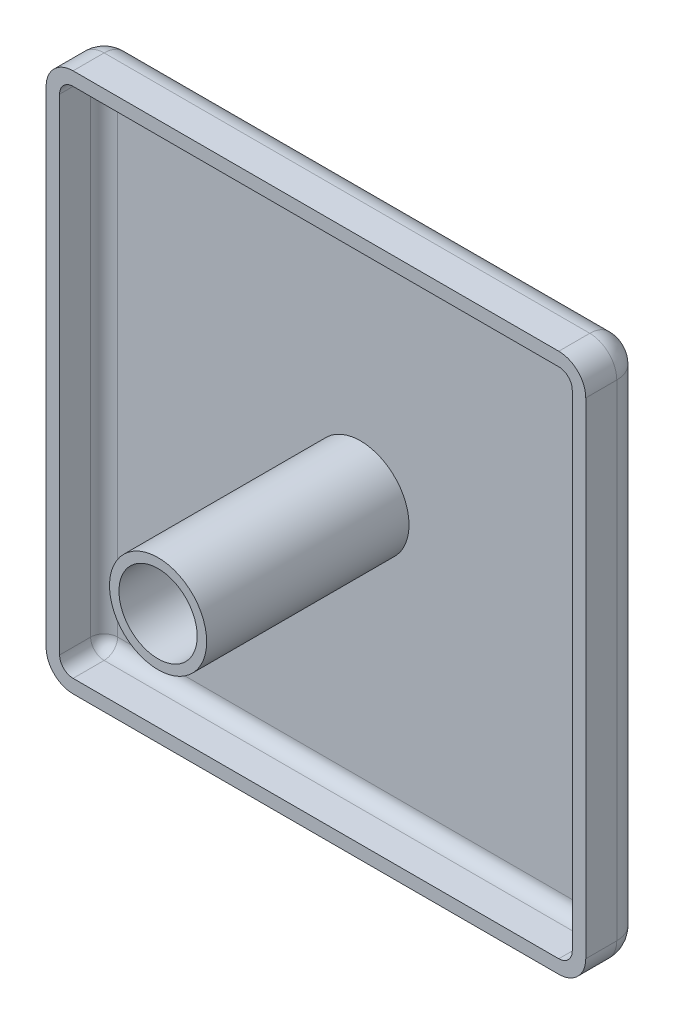
ISO-10303-21;
HEADER;
FILE_DESCRIPTION(('STEP AP214'),'2;1');
FILE_NAME('part.step','',(''),(''),'','','');
FILE_SCHEMA(('AUTOMOTIVE_DESIGN { 1 0 10303 214 1 1 1 1 }'));
ENDSEC;
DATA;
#1=APPLICATION_CONTEXT('core data for automotive mechanical design processes');
#2=APPLICATION_PROTOCOL_DEFINITION('international standard','automotive_design',2000,#1);
#3=PRODUCT_CONTEXT('',#1,'mechanical');
#4=PRODUCT('Part','Part','',(#3));
#5=PRODUCT_RELATED_PRODUCT_CATEGORY('part','',(#4));
#6=PRODUCT_DEFINITION_FORMATION('','',#4);
#7=PRODUCT_DEFINITION_CONTEXT('part definition',#1,'design');
#8=PRODUCT_DEFINITION('design','',#6,#7);
#9=PRODUCT_DEFINITION_SHAPE('','',#8);
#10=(LENGTH_UNIT() NAMED_UNIT(*) SI_UNIT(.MILLI.,.METRE.));
#11=(NAMED_UNIT(*) PLANE_ANGLE_UNIT() SI_UNIT($,.RADIAN.));
#12=(NAMED_UNIT(*) SI_UNIT($,.STERADIAN.) SOLID_ANGLE_UNIT());
#13=UNCERTAINTY_MEASURE_WITH_UNIT(LENGTH_MEASURE(1.E-05),#10,'distance_accuracy_value','');
#14=(GEOMETRIC_REPRESENTATION_CONTEXT(3) GLOBAL_UNCERTAINTY_ASSIGNED_CONTEXT((#13)) GLOBAL_UNIT_ASSIGNED_CONTEXT((#10,
#11,#12)) REPRESENTATION_CONTEXT('',''));
#15=CARTESIAN_POINT('',(0.,0.,0.));
#16=DIRECTION('',(0.,0.,1.));
#17=DIRECTION('',(1.,0.,0.));
#18=AXIS2_PLACEMENT_3D('',#15,#16,#17);
#19=CARTESIAN_POINT('',(20.,-20.,1.));
#20=DIRECTION('',(0.,0.,1.));
#21=DIRECTION('',(1.,0.,0.));
#22=AXIS2_PLACEMENT_3D('',#19,#20,#21);
#23=PLANE('',#22);
#24=DIRECTION('',(0.,1.,0.));
#25=VECTOR('',#24,1.);
#26=CARTESIAN_POINT('',(-18.,-20.,1.));
#27=LINE('',#26,#25);
#28=CARTESIAN_POINT('',(-18.,-18.,1.));
#29=VERTEX_POINT('',#28);
#30=CARTESIAN_POINT('',(-18.,18.,1.));
#31=VERTEX_POINT('',#30);
#32=EDGE_CURVE('E238',#29,#31,#27,.T.);
#33=ORIENTED_EDGE('',*,*,#32,.F.);
#34=DIRECTION('',(1.,0.,0.));
#35=VECTOR('',#34,1.);
#36=CARTESIAN_POINT('',(20.,-18.,1.));
#37=LINE('',#36,#35);
#38=CARTESIAN_POINT('',(18.,-18.,1.));
#39=VERTEX_POINT('',#38);
#40=EDGE_CURVE('E240',#39,#29,#37,.F.);
#41=ORIENTED_EDGE('',*,*,#40,.F.);
#42=DIRECTION('',(0.,1.,0.));
#43=VECTOR('',#42,1.);
#44=CARTESIAN_POINT('',(18.,-20.,1.));
#45=LINE('',#44,#43);
#46=CARTESIAN_POINT('',(18.,18.,1.));
#47=VERTEX_POINT('',#46);
#48=EDGE_CURVE('E206',#47,#39,#45,.F.);
#49=ORIENTED_EDGE('',*,*,#48,.F.);
#50=DIRECTION('',(1.,0.,0.));
#51=VECTOR('',#50,1.);
#52=CARTESIAN_POINT('',(20.,18.,1.));
#53=LINE('',#52,#51);
#54=EDGE_CURVE('E232',#31,#47,#53,.T.);
#55=ORIENTED_EDGE('',*,*,#54,.F.);
#56=EDGE_LOOP('',(#33,#41,#49,#55));
#57=FACE_BOUND('',#56,.T.);
#58=CARTESIAN_POINT('',(0.,0.,1.));
#59=DIRECTION('',(0.,0.,1.));
#60=DIRECTION('',(1.,0.,0.));
#61=AXIS2_PLACEMENT_3D('',#58,#59,#60);
#62=CIRCLE('',#61,3.6);
#63=CARTESIAN_POINT('',(3.6,0.,1.));
#64=VERTEX_POINT('',#63);
#65=EDGE_CURVE('E790',#64,#64,#62,.T.);
#66=ORIENTED_EDGE('',*,*,#65,.F.);
#67=EDGE_LOOP('',(#66));
#68=FACE_BOUND('',#67,.T.);
#69=ADVANCED_FACE('F37',(#57,#68),#23,.T.);
#70=CARTESIAN_POINT('',(20.,20.,4.3));
#71=DIRECTION('',(-1.,0.,0.));
#72=DIRECTION('',(0.,-1.,0.));
#73=AXIS2_PLACEMENT_3D('',#70,#71,#72);
#74=PLANE('',#73);
#75=DIRECTION('',(0.,1.,0.));
#76=VECTOR('',#75,1.);
#77=CARTESIAN_POINT('',(20.,20.,4.3));
#78=LINE('',#77,#76);
#79=CARTESIAN_POINT('',(20.,-18.,4.3));
#80=VERTEX_POINT('',#79);
#81=CARTESIAN_POINT('',(20.,18.,4.3));
#82=VERTEX_POINT('',#81);
#83=EDGE_CURVE('E284',#80,#82,#78,.T.);
#84=ORIENTED_EDGE('',*,*,#83,.F.);
#85=DIRECTION('',(0.,0.,-1.));
#86=VECTOR('',#85,1.);
#87=CARTESIAN_POINT('',(20.,-18.,4.3));
#88=LINE('',#87,#86);
#89=CARTESIAN_POINT('',(20.,-18.,2.));
#90=VERTEX_POINT('',#89);
#91=EDGE_CURVE('E62',#80,#90,#88,.T.);
#92=ORIENTED_EDGE('',*,*,#91,.T.);
#93=DIRECTION('',(0.,1.,0.));
#94=VECTOR('',#93,1.);
#95=CARTESIAN_POINT('',(20.,20.,2.));
#96=LINE('',#95,#94);
#97=CARTESIAN_POINT('',(20.,18.,2.));
#98=VERTEX_POINT('',#97);
#99=EDGE_CURVE('E326',#90,#98,#96,.T.);
#100=ORIENTED_EDGE('',*,*,#99,.T.);
#101=DIRECTION('',(0.,0.,-1.));
#102=VECTOR('',#101,1.);
#103=CARTESIAN_POINT('',(20.,18.,4.3));
#104=LINE('',#103,#102);
#105=EDGE_CURVE('E324',#98,#82,#104,.F.);
#106=ORIENTED_EDGE('',*,*,#105,.T.);
#107=EDGE_LOOP('',(#84,#92,#100,#106));
#108=FACE_BOUND('',#107,.T.);
#109=ADVANCED_FACE('F376',(#108),#74,.F.);
#110=CARTESIAN_POINT('',(-20.,20.,4.3));
#111=DIRECTION('',(0.,-1.,0.));
#112=DIRECTION('',(0.,0.,-1.));
#113=AXIS2_PLACEMENT_3D('',#110,#111,#112);
#114=PLANE('',#113);
#115=DIRECTION('',(-1.,0.,0.));
#116=VECTOR('',#115,1.);
#117=CARTESIAN_POINT('',(-20.,20.,4.3));
#118=LINE('',#117,#116);
#119=CARTESIAN_POINT('',(18.,20.,4.3));
#120=VERTEX_POINT('',#119);
#121=CARTESIAN_POINT('',(-18.,20.,4.3));
#122=VERTEX_POINT('',#121);
#123=EDGE_CURVE('E287',#120,#122,#118,.T.);
#124=ORIENTED_EDGE('',*,*,#123,.F.);
#125=DIRECTION('',(0.,0.,-1.));
#126=VECTOR('',#125,1.);
#127=CARTESIAN_POINT('',(18.,20.,4.3));
#128=LINE('',#127,#126);
#129=CARTESIAN_POINT('',(18.,20.,2.));
#130=VERTEX_POINT('',#129);
#131=EDGE_CURVE('E301',#120,#130,#128,.T.);
#132=ORIENTED_EDGE('',*,*,#131,.T.);
#133=DIRECTION('',(-1.,0.,0.));
#134=VECTOR('',#133,1.);
#135=CARTESIAN_POINT('',(-20.,20.,2.));
#136=LINE('',#135,#134);
#137=CARTESIAN_POINT('',(-18.,20.,2.));
#138=VERTEX_POINT('',#137);
#139=EDGE_CURVE('E298',#130,#138,#136,.T.);
#140=ORIENTED_EDGE('',*,*,#139,.T.);
#141=DIRECTION('',(0.,0.,-1.));
#142=VECTOR('',#141,1.);
#143=CARTESIAN_POINT('',(-18.,20.,4.3));
#144=LINE('',#143,#142);
#145=EDGE_CURVE('E296',#138,#122,#144,.F.);
#146=ORIENTED_EDGE('',*,*,#145,.T.);
#147=EDGE_LOOP('',(#124,#132,#140,#146));
#148=FACE_BOUND('',#147,.T.);
#149=ADVANCED_FACE('F388',(#148),#114,.F.);
#150=CARTESIAN_POINT('',(-20.,20.,4.3));
#151=DIRECTION('',(1.,0.,0.));
#152=DIRECTION('',(0.,1.,0.));
#153=AXIS2_PLACEMENT_3D('',#150,#151,#152);
#154=PLANE('',#153);
#155=DIRECTION('',(0.,-1.,0.));
#156=VECTOR('',#155,1.);
#157=CARTESIAN_POINT('',(-20.,20.,2.));
#158=LINE('',#157,#156);
#159=CARTESIAN_POINT('',(-20.,18.,2.));
#160=VERTEX_POINT('',#159);
#161=CARTESIAN_POINT('',(-20.,-18.,2.));
#162=VERTEX_POINT('',#161);
#163=EDGE_CURVE('E314',#160,#162,#158,.T.);
#164=ORIENTED_EDGE('',*,*,#163,.T.);
#165=DIRECTION('',(0.,0.,-1.));
#166=VECTOR('',#165,1.);
#167=CARTESIAN_POINT('',(-20.,-18.,4.3));
#168=LINE('',#167,#166);
#169=CARTESIAN_POINT('',(-20.,-18.,4.3));
#170=VERTEX_POINT('',#169);
#171=EDGE_CURVE('E316',#162,#170,#168,.F.);
#172=ORIENTED_EDGE('',*,*,#171,.T.);
#173=DIRECTION('',(0.,-1.,0.));
#174=VECTOR('',#173,1.);
#175=CARTESIAN_POINT('',(-20.,20.,4.3));
#176=LINE('',#175,#174);
#177=CARTESIAN_POINT('',(-20.,18.,4.3));
#178=VERTEX_POINT('',#177);
#179=EDGE_CURVE('E290',#178,#170,#176,.T.);
#180=ORIENTED_EDGE('',*,*,#179,.F.);
#181=DIRECTION('',(0.,0.,-1.));
#182=VECTOR('',#181,1.);
#183=CARTESIAN_POINT('',(-20.,18.,4.3));
#184=LINE('',#183,#182);
#185=EDGE_CURVE('E312',#178,#160,#184,.T.);
#186=ORIENTED_EDGE('',*,*,#185,.T.);
#187=EDGE_LOOP('',(#164,#172,#180,#186));
#188=FACE_BOUND('',#187,.T.);
#189=ADVANCED_FACE('F398',(#188),#154,.F.);
#190=CARTESIAN_POINT('',(-20.,-20.,4.3));
#191=DIRECTION('',(0.,1.,0.));
#192=DIRECTION('',(0.,0.,1.));
#193=AXIS2_PLACEMENT_3D('',#190,#191,#192);
#194=PLANE('',#193);
#195=DIRECTION('',(1.,0.,0.));
#196=VECTOR('',#195,1.);
#197=CARTESIAN_POINT('',(-20.,-20.,4.3));
#198=LINE('',#197,#196);
#199=CARTESIAN_POINT('',(-18.,-20.,4.3));
#200=VERTEX_POINT('',#199);
#201=CARTESIAN_POINT('',(18.,-20.,4.3));
#202=VERTEX_POINT('',#201);
#203=EDGE_CURVE('E293',#200,#202,#198,.T.);
#204=ORIENTED_EDGE('',*,*,#203,.F.);
#205=DIRECTION('',(0.,0.,-1.));
#206=VECTOR('',#205,1.);
#207=CARTESIAN_POINT('',(-18.,-20.,4.3));
#208=LINE('',#207,#206);
#209=CARTESIAN_POINT('',(-18.,-20.,2.));
#210=VERTEX_POINT('',#209);
#211=EDGE_CURVE('E322',#200,#210,#208,.T.);
#212=ORIENTED_EDGE('',*,*,#211,.T.);
#213=DIRECTION('',(1.,0.,0.));
#214=VECTOR('',#213,1.);
#215=CARTESIAN_POINT('',(-20.,-20.,2.));
#216=LINE('',#215,#214);
#217=CARTESIAN_POINT('',(18.,-20.,2.));
#218=VERTEX_POINT('',#217);
#219=EDGE_CURVE('E320',#210,#218,#216,.T.);
#220=ORIENTED_EDGE('',*,*,#219,.T.);
#221=DIRECTION('',(0.,0.,-1.));
#222=VECTOR('',#221,1.);
#223=CARTESIAN_POINT('',(18.,-20.,4.3));
#224=LINE('',#223,#222);
#225=EDGE_CURVE('E318',#218,#202,#224,.F.);
#226=ORIENTED_EDGE('',*,*,#225,.T.);
#227=EDGE_LOOP('',(#204,#212,#220,#226));
#228=FACE_BOUND('',#227,.T.);
#229=ADVANCED_FACE('F420',(#228),#194,.F.);
#230=CARTESIAN_POINT('',(20.,-20.,4.3));
#231=DIRECTION('',(0.,0.,1.));
#232=DIRECTION('',(1.,0.,0.));
#233=AXIS2_PLACEMENT_3D('',#230,#231,#232);
#234=PLANE('',#233);
#235=DIRECTION('',(0.,-1.,0.));
#236=VECTOR('',#235,1.);
#237=CARTESIAN_POINT('',(-19.,20.,4.3));
#238=LINE('',#237,#236);
#239=CARTESIAN_POINT('',(-19.,18.,4.3));
#240=VERTEX_POINT('',#239);
#241=CARTESIAN_POINT('',(-19.,-18.,4.3));
#242=VERTEX_POINT('',#241);
#243=EDGE_CURVE('E274',#240,#242,#238,.T.);
#244=ORIENTED_EDGE('',*,*,#243,.F.);
#245=CARTESIAN_POINT('',(-18.,18.,4.3));
#246=DIRECTION('',(0.,0.,1.));
#247=DIRECTION('',(1.,0.,0.));
#248=AXIS2_PLACEMENT_3D('',#245,#246,#247);
#249=CIRCLE('',#248,1.);
#250=CARTESIAN_POINT('',(-18.,19.,4.3));
#251=VERTEX_POINT('',#250);
#252=EDGE_CURVE('E188',#251,#240,#249,.T.);
#253=ORIENTED_EDGE('',*,*,#252,.F.);
#254=DIRECTION('',(-1.,0.,0.));
#255=VECTOR('',#254,1.);
#256=CARTESIAN_POINT('',(-20.,19.,4.3));
#257=LINE('',#256,#255);
#258=CARTESIAN_POINT('',(18.,19.,4.3));
#259=VERTEX_POINT('',#258);
#260=EDGE_CURVE('E54',#259,#251,#257,.T.);
#261=ORIENTED_EDGE('',*,*,#260,.F.);
#262=CARTESIAN_POINT('',(18.,18.,4.3));
#263=DIRECTION('',(0.,0.,1.));
#264=DIRECTION('',(1.,0.,0.));
#265=AXIS2_PLACEMENT_3D('',#262,#263,#264);
#266=CIRCLE('',#265,1.);
#267=CARTESIAN_POINT('',(19.,18.,4.3));
#268=VERTEX_POINT('',#267);
#269=EDGE_CURVE('E271',#268,#259,#266,.T.);
#270=ORIENTED_EDGE('',*,*,#269,.F.);
#271=DIRECTION('',(0.,1.,0.));
#272=VECTOR('',#271,1.);
#273=CARTESIAN_POINT('',(19.,20.,4.3));
#274=LINE('',#273,#272);
#275=CARTESIAN_POINT('',(19.,-18.,4.3));
#276=VERTEX_POINT('',#275);
#277=EDGE_CURVE('E246',#276,#268,#274,.T.);
#278=ORIENTED_EDGE('',*,*,#277,.F.);
#279=CARTESIAN_POINT('',(18.,-18.,4.3));
#280=DIRECTION('',(0.,0.,1.));
#281=DIRECTION('',(1.,0.,0.));
#282=AXIS2_PLACEMENT_3D('',#279,#280,#281);
#283=CIRCLE('',#282,1.);
#284=CARTESIAN_POINT('',(18.,-19.,4.3));
#285=VERTEX_POINT('',#284);
#286=EDGE_CURVE('E183',#285,#276,#283,.T.);
#287=ORIENTED_EDGE('',*,*,#286,.F.);
#288=DIRECTION('',(1.,0.,0.));
#289=VECTOR('',#288,1.);
#290=CARTESIAN_POINT('',(-20.,-19.,4.3));
#291=LINE('',#290,#289);
#292=CARTESIAN_POINT('',(-18.,-19.,4.3));
#293=VERTEX_POINT('',#292);
#294=EDGE_CURVE('E259',#293,#285,#291,.T.);
#295=ORIENTED_EDGE('',*,*,#294,.F.);
#296=CARTESIAN_POINT('',(-18.,-18.,4.3));
#297=DIRECTION('',(0.,0.,1.));
#298=DIRECTION('',(1.,0.,0.));
#299=AXIS2_PLACEMENT_3D('',#296,#297,#298);
#300=CIRCLE('',#299,1.);
#301=EDGE_CURVE('E278',#242,#293,#300,.T.);
#302=ORIENTED_EDGE('',*,*,#301,.F.);
#303=EDGE_LOOP('',(#244,#253,#261,#270,#278,#287,#295,#302));
#304=FACE_BOUND('',#303,.T.);
#305=ORIENTED_EDGE('',*,*,#179,.T.);
#306=CARTESIAN_POINT('',(-18.,-18.,4.3));
#307=DIRECTION('',(0.,0.,1.));
#308=DIRECTION('',(1.,0.,0.));
#309=AXIS2_PLACEMENT_3D('',#306,#307,#308);
#310=CIRCLE('',#309,2.);
#311=EDGE_CURVE('E11',#170,#200,#310,.T.);
#312=ORIENTED_EDGE('',*,*,#311,.T.);
#313=ORIENTED_EDGE('',*,*,#203,.T.);
#314=CARTESIAN_POINT('',(18.,-18.,4.3));
#315=DIRECTION('',(0.,0.,1.));
#316=DIRECTION('',(1.,0.,0.));
#317=AXIS2_PLACEMENT_3D('',#314,#315,#316);
#318=CIRCLE('',#317,2.);
#319=EDGE_CURVE('E46',#202,#80,#318,.T.);
#320=ORIENTED_EDGE('',*,*,#319,.T.);
#321=ORIENTED_EDGE('',*,*,#83,.T.);
#322=CARTESIAN_POINT('',(18.,18.,4.3));
#323=DIRECTION('',(0.,0.,1.));
#324=DIRECTION('',(1.,0.,0.));
#325=AXIS2_PLACEMENT_3D('',#322,#323,#324);
#326=CIRCLE('',#325,2.);
#327=EDGE_CURVE('E331',#82,#120,#326,.T.);
#328=ORIENTED_EDGE('',*,*,#327,.T.);
#329=ORIENTED_EDGE('',*,*,#123,.T.);
#330=CARTESIAN_POINT('',(-18.,18.,4.3));
#331=DIRECTION('',(0.,0.,1.));
#332=DIRECTION('',(1.,0.,0.));
#333=AXIS2_PLACEMENT_3D('',#330,#331,#332);
#334=CIRCLE('',#333,2.);
#335=EDGE_CURVE('E329',#122,#178,#334,.T.);
#336=ORIENTED_EDGE('',*,*,#335,.T.);
#337=EDGE_LOOP('',(#305,#312,#313,#320,#321,#328,#329,#336));
#338=FACE_BOUND('',#337,.T.);
#339=ADVANCED_FACE('F385',(#304,#338),#234,.T.);
#340=CARTESIAN_POINT('',(20.,-20.,0.));
#341=DIRECTION('',(0.,0.,1.));
#342=DIRECTION('',(1.,0.,0.));
#343=AXIS2_PLACEMENT_3D('',#340,#341,#342);
#344=PLANE('',#343);
#345=DIRECTION('',(0.,-1.,0.));
#346=VECTOR('',#345,1.);
#347=CARTESIAN_POINT('',(-18.,-20.,0.));
#348=LINE('',#347,#346);
#349=CARTESIAN_POINT('',(-18.,-18.,0.));
#350=VERTEX_POINT('',#349);
#351=CARTESIAN_POINT('',(-18.,18.,0.));
#352=VERTEX_POINT('',#351);
#353=EDGE_CURVE('E307',#350,#352,#348,.F.);
#354=ORIENTED_EDGE('',*,*,#353,.T.);
#355=DIRECTION('',(-1.,0.,0.));
#356=VECTOR('',#355,1.);
#357=CARTESIAN_POINT('',(20.,18.,0.));
#358=LINE('',#357,#356);
#359=CARTESIAN_POINT('',(18.,18.,0.));
#360=VERTEX_POINT('',#359);
#361=EDGE_CURVE('E309',#352,#360,#358,.F.);
#362=ORIENTED_EDGE('',*,*,#361,.T.);
#363=DIRECTION('',(0.,1.,0.));
#364=VECTOR('',#363,1.);
#365=CARTESIAN_POINT('',(18.,-20.,0.));
#366=LINE('',#365,#364);
#367=CARTESIAN_POINT('',(18.,-18.,0.));
#368=VERTEX_POINT('',#367);
#369=EDGE_CURVE('E303',#360,#368,#366,.F.);
#370=ORIENTED_EDGE('',*,*,#369,.T.);
#371=DIRECTION('',(1.,0.,0.));
#372=VECTOR('',#371,1.);
#373=CARTESIAN_POINT('',(20.,-18.,0.));
#374=LINE('',#373,#372);
#375=EDGE_CURVE('E305',#368,#350,#374,.F.);
#376=ORIENTED_EDGE('',*,*,#375,.T.);
#377=EDGE_LOOP('',(#354,#362,#370,#376));
#378=FACE_BOUND('',#377,.T.);
#379=ADVANCED_FACE('F415',(#378),#344,.F.);
#380=CARTESIAN_POINT('',(18.,-18.,4.3));
#381=DIRECTION('',(0.,0.,-1.));
#382=DIRECTION('',(-1.,0.,0.));
#383=AXIS2_PLACEMENT_3D('',#380,#381,#382);
#384=CYLINDRICAL_SURFACE('',#383,2.);
#385=ORIENTED_EDGE('',*,*,#319,.F.);
#386=ORIENTED_EDGE('',*,*,#225,.F.);
#387=CARTESIAN_POINT('',(18.,-18.,2.));
#388=DIRECTION('',(0.,0.,-1.));
#389=DIRECTION('',(-1.,0.,0.));
#390=AXIS2_PLACEMENT_3D('',#387,#388,#389);
#391=CIRCLE('',#390,2.);
#392=EDGE_CURVE('E360',#90,#218,#391,.T.);
#393=ORIENTED_EDGE('',*,*,#392,.F.);
#394=ORIENTED_EDGE('',*,*,#91,.F.);
#395=EDGE_LOOP('',(#385,#386,#393,#394));
#396=FACE_BOUND('',#395,.T.);
#397=ADVANCED_FACE('F39',(#396),#384,.T.);
#398=CARTESIAN_POINT('',(-18.,-18.,4.3));
#399=DIRECTION('',(0.,0.,-1.));
#400=DIRECTION('',(-1.,0.,0.));
#401=AXIS2_PLACEMENT_3D('',#398,#399,#400);
#402=CYLINDRICAL_SURFACE('',#401,2.);
#403=ORIENTED_EDGE('',*,*,#311,.F.);
#404=ORIENTED_EDGE('',*,*,#171,.F.);
#405=CARTESIAN_POINT('',(-18.,-18.,2.));
#406=DIRECTION('',(0.,0.,-1.));
#407=DIRECTION('',(-1.,0.,0.));
#408=AXIS2_PLACEMENT_3D('',#405,#406,#407);
#409=CIRCLE('',#408,2.);
#410=EDGE_CURVE('E358',#210,#162,#409,.T.);
#411=ORIENTED_EDGE('',*,*,#410,.F.);
#412=ORIENTED_EDGE('',*,*,#211,.F.);
#413=EDGE_LOOP('',(#403,#404,#411,#412));
#414=FACE_BOUND('',#413,.T.);
#415=ADVANCED_FACE('F403',(#414),#402,.T.);
#416=CARTESIAN_POINT('',(-20.,-18.,2.));
#417=DIRECTION('',(1.,0.,0.));
#418=DIRECTION('',(0.,0.,-1.));
#419=AXIS2_PLACEMENT_3D('',#416,#417,#418);
#420=CYLINDRICAL_SURFACE('',#419,2.);
#421=CARTESIAN_POINT('',(18.,-18.,2.));
#422=DIRECTION('',(1.,0.,0.));
#423=DIRECTION('',(0.,0.,-1.));
#424=AXIS2_PLACEMENT_3D('',#421,#422,#423);
#425=CIRCLE('',#424,2.);
#426=EDGE_CURVE('E41',#218,#368,#425,.T.);
#427=ORIENTED_EDGE('',*,*,#426,.F.);
#428=ORIENTED_EDGE('',*,*,#219,.F.);
#429=CARTESIAN_POINT('',(-18.,-18.,2.));
#430=DIRECTION('',(-1.,0.,0.));
#431=DIRECTION('',(0.,0.,1.));
#432=AXIS2_PLACEMENT_3D('',#429,#430,#431);
#433=CIRCLE('',#432,2.);
#434=EDGE_CURVE('E355',#350,#210,#433,.T.);
#435=ORIENTED_EDGE('',*,*,#434,.F.);
#436=ORIENTED_EDGE('',*,*,#375,.F.);
#437=EDGE_LOOP('',(#427,#428,#435,#436));
#438=FACE_BOUND('',#437,.T.);
#439=ADVANCED_FACE('F416',(#438),#420,.T.);
#440=CARTESIAN_POINT('',(18.,-18.,2.));
#441=DIRECTION('',(0.,0.,1.));
#442=DIRECTION('',(1.,0.,0.));
#443=AXIS2_PLACEMENT_3D('',#440,#441,#442);
#444=SPHERICAL_SURFACE('',#443,2.);
#445=ORIENTED_EDGE('',*,*,#392,.T.);
#446=ORIENTED_EDGE('',*,*,#426,.T.);
#447=CARTESIAN_POINT('',(18.,-18.,2.));
#448=DIRECTION('',(0.,-1.,0.));
#449=DIRECTION('',(1.,0.,0.));
#450=AXIS2_PLACEMENT_3D('',#447,#448,#449);
#451=CIRCLE('',#450,2.);
#452=EDGE_CURVE('E352',#90,#368,#451,.F.);
#453=ORIENTED_EDGE('',*,*,#452,.F.);
#454=EDGE_LOOP('',(#445,#446,#453));
#455=FACE_BOUND('',#454,.T.);
#456=ADVANCED_FACE('F366',(#455),#444,.T.);
#457=CARTESIAN_POINT('',(-18.,-18.,2.));
#458=DIRECTION('',(0.,0.,1.));
#459=DIRECTION('',(1.,0.,0.));
#460=AXIS2_PLACEMENT_3D('',#457,#458,#459);
#461=SPHERICAL_SURFACE('',#460,2.);
#462=ORIENTED_EDGE('',*,*,#434,.T.);
#463=ORIENTED_EDGE('',*,*,#410,.T.);
#464=CARTESIAN_POINT('',(-18.,-18.,2.));
#465=DIRECTION('',(0.,-1.,0.));
#466=DIRECTION('',(0.,0.,-1.));
#467=AXIS2_PLACEMENT_3D('',#464,#465,#466);
#468=CIRCLE('',#467,2.);
#469=EDGE_CURVE('E349',#350,#162,#468,.F.);
#470=ORIENTED_EDGE('',*,*,#469,.F.);
#471=EDGE_LOOP('',(#462,#463,#470));
#472=FACE_BOUND('',#471,.T.);
#473=ADVANCED_FACE('F407',(#472),#461,.T.);
#474=CARTESIAN_POINT('',(18.,20.,2.));
#475=DIRECTION('',(0.,1.,0.));
#476=DIRECTION('',(-1.,0.,0.));
#477=AXIS2_PLACEMENT_3D('',#474,#475,#476);
#478=CYLINDRICAL_SURFACE('',#477,2.);
#479=ORIENTED_EDGE('',*,*,#452,.T.);
#480=ORIENTED_EDGE('',*,*,#369,.F.);
#481=CARTESIAN_POINT('',(18.,18.,2.));
#482=DIRECTION('',(0.,1.,0.));
#483=DIRECTION('',(0.,0.,1.));
#484=AXIS2_PLACEMENT_3D('',#481,#482,#483);
#485=CIRCLE('',#484,2.);
#486=EDGE_CURVE('E346',#98,#360,#485,.T.);
#487=ORIENTED_EDGE('',*,*,#486,.F.);
#488=ORIENTED_EDGE('',*,*,#99,.F.);
#489=EDGE_LOOP('',(#479,#480,#487,#488));
#490=FACE_BOUND('',#489,.T.);
#491=ADVANCED_FACE('F373',(#490),#478,.T.);
#492=CARTESIAN_POINT('',(18.,18.,4.3));
#493=DIRECTION('',(0.,0.,-1.));
#494=DIRECTION('',(-1.,0.,0.));
#495=AXIS2_PLACEMENT_3D('',#492,#493,#494);
#496=CYLINDRICAL_SURFACE('',#495,2.);
#497=ORIENTED_EDGE('',*,*,#327,.F.);
#498=ORIENTED_EDGE('',*,*,#105,.F.);
#499=CARTESIAN_POINT('',(18.,18.,2.));
#500=DIRECTION('',(0.,0.,-1.));
#501=DIRECTION('',(-1.,0.,0.));
#502=AXIS2_PLACEMENT_3D('',#499,#500,#501);
#503=CIRCLE('',#502,2.);
#504=EDGE_CURVE('E343',#130,#98,#503,.T.);
#505=ORIENTED_EDGE('',*,*,#504,.F.);
#506=ORIENTED_EDGE('',*,*,#131,.F.);
#507=EDGE_LOOP('',(#497,#498,#505,#506));
#508=FACE_BOUND('',#507,.T.);
#509=ADVANCED_FACE('F380',(#508),#496,.T.);
#510=CARTESIAN_POINT('',(-18.,18.,4.3));
#511=DIRECTION('',(0.,0.,-1.));
#512=DIRECTION('',(-1.,0.,0.));
#513=AXIS2_PLACEMENT_3D('',#510,#511,#512);
#514=CYLINDRICAL_SURFACE('',#513,2.);
#515=ORIENTED_EDGE('',*,*,#335,.F.);
#516=ORIENTED_EDGE('',*,*,#145,.F.);
#517=CARTESIAN_POINT('',(-18.,18.,2.));
#518=DIRECTION('',(0.,0.,-1.));
#519=DIRECTION('',(-1.,0.,0.));
#520=AXIS2_PLACEMENT_3D('',#517,#518,#519);
#521=CIRCLE('',#520,2.);
#522=EDGE_CURVE('E340',#160,#138,#521,.T.);
#523=ORIENTED_EDGE('',*,*,#522,.F.);
#524=ORIENTED_EDGE('',*,*,#185,.F.);
#525=EDGE_LOOP('',(#515,#516,#523,#524));
#526=FACE_BOUND('',#525,.T.);
#527=ADVANCED_FACE('F393',(#526),#514,.T.);
#528=CARTESIAN_POINT('',(-18.,20.,2.));
#529=DIRECTION('',(0.,-1.,0.));
#530=DIRECTION('',(1.,0.,0.));
#531=AXIS2_PLACEMENT_3D('',#528,#529,#530);
#532=CYLINDRICAL_SURFACE('',#531,2.);
#533=ORIENTED_EDGE('',*,*,#469,.T.);
#534=ORIENTED_EDGE('',*,*,#163,.F.);
#535=CARTESIAN_POINT('',(-18.,18.,2.));
#536=DIRECTION('',(0.,1.,0.));
#537=DIRECTION('',(0.,0.,1.));
#538=AXIS2_PLACEMENT_3D('',#535,#536,#537);
#539=CIRCLE('',#538,2.);
#540=EDGE_CURVE('E337',#352,#160,#539,.T.);
#541=ORIENTED_EDGE('',*,*,#540,.F.);
#542=ORIENTED_EDGE('',*,*,#353,.F.);
#543=EDGE_LOOP('',(#533,#534,#541,#542));
#544=FACE_BOUND('',#543,.T.);
#545=ADVANCED_FACE('F411',(#544),#532,.T.);
#546=CARTESIAN_POINT('',(18.,18.,2.));
#547=DIRECTION('',(0.,0.,1.));
#548=DIRECTION('',(1.,0.,0.));
#549=AXIS2_PLACEMENT_3D('',#546,#547,#548);
#550=SPHERICAL_SURFACE('',#549,2.);
#551=ORIENTED_EDGE('',*,*,#504,.T.);
#552=ORIENTED_EDGE('',*,*,#486,.T.);
#553=CARTESIAN_POINT('',(18.,18.,2.));
#554=DIRECTION('',(1.,0.,0.));
#555=DIRECTION('',(0.,1.,0.));
#556=AXIS2_PLACEMENT_3D('',#553,#554,#555);
#557=CIRCLE('',#556,2.);
#558=EDGE_CURVE('E335',#130,#360,#557,.F.);
#559=ORIENTED_EDGE('',*,*,#558,.F.);
#560=EDGE_LOOP('',(#551,#552,#559));
#561=FACE_BOUND('',#560,.T.);
#562=ADVANCED_FACE('F501',(#561),#550,.T.);
#563=CARTESIAN_POINT('',(-18.,18.,2.));
#564=DIRECTION('',(0.,0.,1.));
#565=DIRECTION('',(1.,0.,0.));
#566=AXIS2_PLACEMENT_3D('',#563,#564,#565);
#567=SPHERICAL_SURFACE('',#566,2.);
#568=ORIENTED_EDGE('',*,*,#540,.T.);
#569=ORIENTED_EDGE('',*,*,#522,.T.);
#570=CARTESIAN_POINT('',(-18.,18.,2.));
#571=DIRECTION('',(-1.,0.,0.));
#572=DIRECTION('',(0.,0.,1.));
#573=AXIS2_PLACEMENT_3D('',#570,#571,#572);
#574=CIRCLE('',#573,2.);
#575=EDGE_CURVE('E280',#352,#138,#574,.F.);
#576=ORIENTED_EDGE('',*,*,#575,.F.);
#577=EDGE_LOOP('',(#568,#569,#576));
#578=FACE_BOUND('',#577,.T.);
#579=ADVANCED_FACE('F497',(#578),#567,.T.);
#580=CARTESIAN_POINT('',(-20.,18.,2.));
#581=DIRECTION('',(-1.,0.,0.));
#582=DIRECTION('',(0.,0.,1.));
#583=AXIS2_PLACEMENT_3D('',#580,#581,#582);
#584=CYLINDRICAL_SURFACE('',#583,2.);
#585=ORIENTED_EDGE('',*,*,#558,.T.);
#586=ORIENTED_EDGE('',*,*,#361,.F.);
#587=ORIENTED_EDGE('',*,*,#575,.T.);
#588=ORIENTED_EDGE('',*,*,#139,.F.);
#589=EDGE_LOOP('',(#585,#586,#587,#588));
#590=FACE_BOUND('',#589,.T.);
#591=ADVANCED_FACE('F494',(#590),#584,.T.);
#592=CARTESIAN_POINT('',(19.,20.,4.3));
#593=DIRECTION('',(-1.,0.,0.));
#594=DIRECTION('',(0.,-1.,0.));
#595=AXIS2_PLACEMENT_3D('',#592,#593,#594);
#596=PLANE('',#595);
#597=ORIENTED_EDGE('',*,*,#277,.T.);
#598=DIRECTION('',(0.,0.,1.));
#599=VECTOR('',#598,1.);
#600=CARTESIAN_POINT('',(19.,18.,4.3));
#601=LINE('',#600,#599);
#602=CARTESIAN_POINT('',(19.,18.,2.));
#603=VERTEX_POINT('',#602);
#604=EDGE_CURVE('E212',#603,#268,#601,.T.);
#605=ORIENTED_EDGE('',*,*,#604,.F.);
#606=DIRECTION('',(0.,-1.,0.));
#607=VECTOR('',#606,1.);
#608=CARTESIAN_POINT('',(19.,20.,2.));
#609=LINE('',#608,#607);
#610=CARTESIAN_POINT('',(19.,-18.,2.));
#611=VERTEX_POINT('',#610);
#612=EDGE_CURVE('E189',#611,#603,#609,.F.);
#613=ORIENTED_EDGE('',*,*,#612,.F.);
#614=DIRECTION('',(0.,0.,1.));
#615=VECTOR('',#614,1.);
#616=CARTESIAN_POINT('',(19.,-18.,4.3));
#617=LINE('',#616,#615);
#618=EDGE_CURVE('E178',#276,#611,#617,.F.);
#619=ORIENTED_EDGE('',*,*,#618,.F.);
#620=EDGE_LOOP('',(#597,#605,#613,#619));
#621=FACE_BOUND('',#620,.T.);
#622=ADVANCED_FACE('F211',(#621),#596,.T.);
#623=CARTESIAN_POINT('',(-20.,19.,4.3));
#624=DIRECTION('',(0.,-1.,0.));
#625=DIRECTION('',(0.,0.,-1.));
#626=AXIS2_PLACEMENT_3D('',#623,#624,#625);
#627=PLANE('',#626);
#628=ORIENTED_EDGE('',*,*,#260,.T.);
#629=DIRECTION('',(0.,0.,-1.));
#630=VECTOR('',#629,1.);
#631=CARTESIAN_POINT('',(-18.,19.,4.3));
#632=LINE('',#631,#630);
#633=CARTESIAN_POINT('',(-18.,19.,2.));
#634=VERTEX_POINT('',#633);
#635=EDGE_CURVE('E257',#634,#251,#632,.F.);
#636=ORIENTED_EDGE('',*,*,#635,.F.);
#637=DIRECTION('',(1.,0.,0.));
#638=VECTOR('',#637,1.);
#639=CARTESIAN_POINT('',(-20.,19.,2.));
#640=LINE('',#639,#638);
#641=CARTESIAN_POINT('',(18.,19.,2.));
#642=VERTEX_POINT('',#641);
#643=EDGE_CURVE('E254',#642,#634,#640,.F.);
#644=ORIENTED_EDGE('',*,*,#643,.F.);
#645=DIRECTION('',(0.,0.,-1.));
#646=VECTOR('',#645,1.);
#647=CARTESIAN_POINT('',(18.,19.,4.3));
#648=LINE('',#647,#646);
#649=EDGE_CURVE('E244',#259,#642,#648,.T.);
#650=ORIENTED_EDGE('',*,*,#649,.F.);
#651=EDGE_LOOP('',(#628,#636,#644,#650));
#652=FACE_BOUND('',#651,.T.);
#653=ADVANCED_FACE('F566',(#652),#627,.T.);
#654=CARTESIAN_POINT('',(-19.,20.,4.3));
#655=DIRECTION('',(1.,0.,0.));
#656=DIRECTION('',(0.,1.,0.));
#657=AXIS2_PLACEMENT_3D('',#654,#655,#656);
#658=PLANE('',#657);
#659=DIRECTION('',(0.,1.,0.));
#660=VECTOR('',#659,1.);
#661=CARTESIAN_POINT('',(-19.,20.,2.));
#662=LINE('',#661,#660);
#663=CARTESIAN_POINT('',(-19.,18.,2.));
#664=VERTEX_POINT('',#663);
#665=CARTESIAN_POINT('',(-19.,-18.,2.));
#666=VERTEX_POINT('',#665);
#667=EDGE_CURVE('E226',#664,#666,#662,.F.);
#668=ORIENTED_EDGE('',*,*,#667,.F.);
#669=DIRECTION('',(0.,0.,1.));
#670=VECTOR('',#669,1.);
#671=CARTESIAN_POINT('',(-19.,18.,4.3));
#672=LINE('',#671,#670);
#673=EDGE_CURVE('E230',#240,#664,#672,.F.);
#674=ORIENTED_EDGE('',*,*,#673,.F.);
#675=ORIENTED_EDGE('',*,*,#243,.T.);
#676=DIRECTION('',(0.,0.,1.));
#677=VECTOR('',#676,1.);
#678=CARTESIAN_POINT('',(-19.,-18.,4.3));
#679=LINE('',#678,#677);
#680=EDGE_CURVE('E221',#666,#242,#679,.T.);
#681=ORIENTED_EDGE('',*,*,#680,.F.);
#682=EDGE_LOOP('',(#668,#674,#675,#681));
#683=FACE_BOUND('',#682,.T.);
#684=ADVANCED_FACE('F573',(#683),#658,.T.);
#685=CARTESIAN_POINT('',(-20.,-19.,4.3));
#686=DIRECTION('',(0.,1.,0.));
#687=DIRECTION('',(0.,0.,1.));
#688=AXIS2_PLACEMENT_3D('',#685,#686,#687);
#689=PLANE('',#688);
#690=ORIENTED_EDGE('',*,*,#294,.T.);
#691=DIRECTION('',(0.,0.,1.));
#692=VECTOR('',#691,1.);
#693=CARTESIAN_POINT('',(18.,-19.,4.3));
#694=LINE('',#693,#692);
#695=CARTESIAN_POINT('',(18.,-19.,2.));
#696=VERTEX_POINT('',#695);
#697=EDGE_CURVE('E219',#696,#285,#694,.T.);
#698=ORIENTED_EDGE('',*,*,#697,.F.);
#699=DIRECTION('',(1.,0.,0.));
#700=VECTOR('',#699,1.);
#701=CARTESIAN_POINT('',(-20.,-19.,2.));
#702=LINE('',#701,#700);
#703=CARTESIAN_POINT('',(-18.,-19.,2.));
#704=VERTEX_POINT('',#703);
#705=EDGE_CURVE('E220',#704,#696,#702,.T.);
#706=ORIENTED_EDGE('',*,*,#705,.F.);
#707=DIRECTION('',(0.,0.,1.));
#708=VECTOR('',#707,1.);
#709=CARTESIAN_POINT('',(-18.,-19.,4.3));
#710=LINE('',#709,#708);
#711=EDGE_CURVE('E215',#293,#704,#710,.F.);
#712=ORIENTED_EDGE('',*,*,#711,.F.);
#713=EDGE_LOOP('',(#690,#698,#706,#712));
#714=FACE_BOUND('',#713,.T.);
#715=ADVANCED_FACE('F440',(#714),#689,.T.);
#716=CARTESIAN_POINT('',(18.,-18.,4.3));
#717=DIRECTION('',(0.,0.,-1.));
#718=DIRECTION('',(-1.,0.,0.));
#719=AXIS2_PLACEMENT_3D('',#716,#717,#718);
#720=CYLINDRICAL_SURFACE('',#719,1.);
#721=ORIENTED_EDGE('',*,*,#286,.T.);
#722=ORIENTED_EDGE('',*,*,#618,.T.);
#723=CARTESIAN_POINT('',(18.,-18.,2.));
#724=DIRECTION('',(0.,0.,1.));
#725=DIRECTION('',(1.,0.,0.));
#726=AXIS2_PLACEMENT_3D('',#723,#724,#725);
#727=CIRCLE('',#726,1.);
#728=EDGE_CURVE('E181',#611,#696,#727,.F.);
#729=ORIENTED_EDGE('',*,*,#728,.T.);
#730=ORIENTED_EDGE('',*,*,#697,.T.);
#731=EDGE_LOOP('',(#721,#722,#729,#730));
#732=FACE_BOUND('',#731,.T.);
#733=ADVANCED_FACE('F180',(#732),#720,.F.);
#734=CARTESIAN_POINT('',(-18.,-18.,4.3));
#735=DIRECTION('',(0.,0.,-1.));
#736=DIRECTION('',(-1.,0.,0.));
#737=AXIS2_PLACEMENT_3D('',#734,#735,#736);
#738=CYLINDRICAL_SURFACE('',#737,1.);
#739=ORIENTED_EDGE('',*,*,#301,.T.);
#740=ORIENTED_EDGE('',*,*,#711,.T.);
#741=CARTESIAN_POINT('',(-18.,-18.,2.));
#742=DIRECTION('',(0.,0.,1.));
#743=DIRECTION('',(1.,0.,0.));
#744=AXIS2_PLACEMENT_3D('',#741,#742,#743);
#745=CIRCLE('',#744,1.);
#746=EDGE_CURVE('E199',#704,#666,#745,.F.);
#747=ORIENTED_EDGE('',*,*,#746,.T.);
#748=ORIENTED_EDGE('',*,*,#680,.T.);
#749=EDGE_LOOP('',(#739,#740,#747,#748));
#750=FACE_BOUND('',#749,.T.);
#751=ADVANCED_FACE('F444',(#750),#738,.F.);
#752=CARTESIAN_POINT('',(-20.,-18.,2.));
#753=DIRECTION('',(1.,0.,0.));
#754=DIRECTION('',(0.,0.,-1.));
#755=AXIS2_PLACEMENT_3D('',#752,#753,#754);
#756=CYLINDRICAL_SURFACE('',#755,1.);
#757=CARTESIAN_POINT('',(18.,-18.,2.));
#758=DIRECTION('',(-1.,0.,0.));
#759=DIRECTION('',(0.,-1.,0.));
#760=AXIS2_PLACEMENT_3D('',#757,#758,#759);
#761=CIRCLE('',#760,1.);
#762=EDGE_CURVE('E198',#696,#39,#761,.F.);
#763=ORIENTED_EDGE('',*,*,#762,.T.);
#764=ORIENTED_EDGE('',*,*,#40,.T.);
#765=CARTESIAN_POINT('',(-18.,-18.,2.));
#766=DIRECTION('',(-1.,0.,0.));
#767=DIRECTION('',(0.,-1.,0.));
#768=AXIS2_PLACEMENT_3D('',#765,#766,#767);
#769=CIRCLE('',#768,1.);
#770=EDGE_CURVE('E208',#29,#704,#769,.T.);
#771=ORIENTED_EDGE('',*,*,#770,.T.);
#772=ORIENTED_EDGE('',*,*,#705,.T.);
#773=EDGE_LOOP('',(#763,#764,#771,#772));
#774=FACE_BOUND('',#773,.T.);
#775=ADVANCED_FACE('F447',(#774),#756,.F.);
#776=CARTESIAN_POINT('',(18.,-18.,2.));
#777=DIRECTION('',(0.,0.,1.));
#778=DIRECTION('',(1.,0.,0.));
#779=AXIS2_PLACEMENT_3D('',#776,#777,#778);
#780=SPHERICAL_SURFACE('',#779,1.);
#781=ORIENTED_EDGE('',*,*,#728,.F.);
#782=CARTESIAN_POINT('',(18.,-18.,2.));
#783=DIRECTION('',(0.,1.,0.));
#784=DIRECTION('',(-1.,0.,0.));
#785=AXIS2_PLACEMENT_3D('',#782,#783,#784);
#786=CIRCLE('',#785,1.);
#787=EDGE_CURVE('E196',#611,#39,#786,.T.);
#788=ORIENTED_EDGE('',*,*,#787,.T.);
#789=ORIENTED_EDGE('',*,*,#762,.F.);
#790=EDGE_LOOP('',(#781,#788,#789));
#791=FACE_BOUND('',#790,.T.);
#792=ADVANCED_FACE('F195',(#791),#780,.F.);
#793=CARTESIAN_POINT('',(-18.,-18.,2.));
#794=DIRECTION('',(0.,0.,1.));
#795=DIRECTION('',(1.,0.,0.));
#796=AXIS2_PLACEMENT_3D('',#793,#794,#795);
#797=SPHERICAL_SURFACE('',#796,1.);
#798=ORIENTED_EDGE('',*,*,#770,.F.);
#799=CARTESIAN_POINT('',(-18.,-18.,2.));
#800=DIRECTION('',(0.,-1.,0.));
#801=DIRECTION('',(1.,0.,0.));
#802=AXIS2_PLACEMENT_3D('',#799,#800,#801);
#803=CIRCLE('',#802,1.);
#804=EDGE_CURVE('E209',#29,#666,#803,.F.);
#805=ORIENTED_EDGE('',*,*,#804,.T.);
#806=ORIENTED_EDGE('',*,*,#746,.F.);
#807=EDGE_LOOP('',(#798,#805,#806));
#808=FACE_BOUND('',#807,.T.);
#809=ADVANCED_FACE('F454',(#808),#797,.F.);
#810=CARTESIAN_POINT('',(18.,20.,2.));
#811=DIRECTION('',(0.,1.,0.));
#812=DIRECTION('',(-1.,0.,0.));
#813=AXIS2_PLACEMENT_3D('',#810,#811,#812);
#814=CYLINDRICAL_SURFACE('',#813,1.);
#815=ORIENTED_EDGE('',*,*,#787,.F.);
#816=ORIENTED_EDGE('',*,*,#612,.T.);
#817=CARTESIAN_POINT('',(18.,18.,2.));
#818=DIRECTION('',(0.,-1.,0.));
#819=DIRECTION('',(0.,0.,-1.));
#820=AXIS2_PLACEMENT_3D('',#817,#818,#819);
#821=CIRCLE('',#820,1.);
#822=EDGE_CURVE('E237',#603,#47,#821,.F.);
#823=ORIENTED_EDGE('',*,*,#822,.T.);
#824=ORIENTED_EDGE('',*,*,#48,.T.);
#825=EDGE_LOOP('',(#815,#816,#823,#824));
#826=FACE_BOUND('',#825,.T.);
#827=ADVANCED_FACE('F202',(#826),#814,.F.);
#828=CARTESIAN_POINT('',(18.,18.,4.3));
#829=DIRECTION('',(0.,0.,-1.));
#830=DIRECTION('',(-1.,0.,0.));
#831=AXIS2_PLACEMENT_3D('',#828,#829,#830);
#832=CYLINDRICAL_SURFACE('',#831,1.);
#833=ORIENTED_EDGE('',*,*,#269,.T.);
#834=ORIENTED_EDGE('',*,*,#649,.T.);
#835=CARTESIAN_POINT('',(18.,18.,2.));
#836=DIRECTION('',(0.,0.,1.));
#837=DIRECTION('',(1.,0.,0.));
#838=AXIS2_PLACEMENT_3D('',#835,#836,#837);
#839=CIRCLE('',#838,1.);
#840=EDGE_CURVE('E249',#642,#603,#839,.F.);
#841=ORIENTED_EDGE('',*,*,#840,.T.);
#842=ORIENTED_EDGE('',*,*,#604,.T.);
#843=EDGE_LOOP('',(#833,#834,#841,#842));
#844=FACE_BOUND('',#843,.T.);
#845=ADVANCED_FACE('F460',(#844),#832,.F.);
#846=CARTESIAN_POINT('',(-18.,18.,4.3));
#847=DIRECTION('',(0.,0.,-1.));
#848=DIRECTION('',(-1.,0.,0.));
#849=AXIS2_PLACEMENT_3D('',#846,#847,#848);
#850=CYLINDRICAL_SURFACE('',#849,1.);
#851=ORIENTED_EDGE('',*,*,#252,.T.);
#852=ORIENTED_EDGE('',*,*,#673,.T.);
#853=CARTESIAN_POINT('',(-18.,18.,2.));
#854=DIRECTION('',(0.,0.,1.));
#855=DIRECTION('',(1.,0.,0.));
#856=AXIS2_PLACEMENT_3D('',#853,#854,#855);
#857=CIRCLE('',#856,1.);
#858=EDGE_CURVE('E252',#664,#634,#857,.F.);
#859=ORIENTED_EDGE('',*,*,#858,.T.);
#860=ORIENTED_EDGE('',*,*,#635,.T.);
#861=EDGE_LOOP('',(#851,#852,#859,#860));
#862=FACE_BOUND('',#861,.T.);
#863=ADVANCED_FACE('F463',(#862),#850,.F.);
#864=CARTESIAN_POINT('',(-18.,20.,2.));
#865=DIRECTION('',(0.,-1.,0.));
#866=DIRECTION('',(1.,0.,0.));
#867=AXIS2_PLACEMENT_3D('',#864,#865,#866);
#868=CYLINDRICAL_SURFACE('',#867,1.);
#869=ORIENTED_EDGE('',*,*,#804,.F.);
#870=ORIENTED_EDGE('',*,*,#32,.T.);
#871=CARTESIAN_POINT('',(-18.,18.,2.));
#872=DIRECTION('',(0.,1.,0.));
#873=DIRECTION('',(-1.,0.,0.));
#874=AXIS2_PLACEMENT_3D('',#871,#872,#873);
#875=CIRCLE('',#874,1.);
#876=EDGE_CURVE('E262',#31,#664,#875,.T.);
#877=ORIENTED_EDGE('',*,*,#876,.T.);
#878=ORIENTED_EDGE('',*,*,#667,.T.);
#879=EDGE_LOOP('',(#869,#870,#877,#878));
#880=FACE_BOUND('',#879,.T.);
#881=ADVANCED_FACE('F467',(#880),#868,.F.);
#882=CARTESIAN_POINT('',(18.,18.,2.));
#883=DIRECTION('',(0.,0.,1.));
#884=DIRECTION('',(1.,0.,0.));
#885=AXIS2_PLACEMENT_3D('',#882,#883,#884);
#886=SPHERICAL_SURFACE('',#885,1.);
#887=ORIENTED_EDGE('',*,*,#840,.F.);
#888=CARTESIAN_POINT('',(18.,18.,2.));
#889=DIRECTION('',(-1.,0.,0.));
#890=DIRECTION('',(0.,0.,1.));
#891=AXIS2_PLACEMENT_3D('',#888,#889,#890);
#892=CIRCLE('',#891,1.);
#893=EDGE_CURVE('E265',#642,#47,#892,.T.);
#894=ORIENTED_EDGE('',*,*,#893,.T.);
#895=ORIENTED_EDGE('',*,*,#822,.F.);
#896=EDGE_LOOP('',(#887,#894,#895));
#897=FACE_BOUND('',#896,.T.);
#898=ADVANCED_FACE('F471',(#897),#886,.F.);
#899=CARTESIAN_POINT('',(-18.,18.,2.));
#900=DIRECTION('',(0.,0.,1.));
#901=DIRECTION('',(1.,0.,0.));
#902=AXIS2_PLACEMENT_3D('',#899,#900,#901);
#903=SPHERICAL_SURFACE('',#902,1.);
#904=ORIENTED_EDGE('',*,*,#876,.F.);
#905=CARTESIAN_POINT('',(-18.,18.,2.));
#906=DIRECTION('',(-1.,0.,0.));
#907=DIRECTION('',(0.,0.,1.));
#908=AXIS2_PLACEMENT_3D('',#905,#906,#907);
#909=CIRCLE('',#908,1.);
#910=EDGE_CURVE('E266',#31,#634,#909,.F.);
#911=ORIENTED_EDGE('',*,*,#910,.T.);
#912=ORIENTED_EDGE('',*,*,#858,.F.);
#913=EDGE_LOOP('',(#904,#911,#912));
#914=FACE_BOUND('',#913,.T.);
#915=ADVANCED_FACE('F475',(#914),#903,.F.);
#916=CARTESIAN_POINT('',(-20.,18.,2.));
#917=DIRECTION('',(-1.,0.,0.));
#918=DIRECTION('',(0.,0.,1.));
#919=AXIS2_PLACEMENT_3D('',#916,#917,#918);
#920=CYLINDRICAL_SURFACE('',#919,1.);
#921=ORIENTED_EDGE('',*,*,#893,.F.);
#922=ORIENTED_EDGE('',*,*,#643,.T.);
#923=ORIENTED_EDGE('',*,*,#910,.F.);
#924=ORIENTED_EDGE('',*,*,#54,.T.);
#925=EDGE_LOOP('',(#921,#922,#923,#924));
#926=FACE_BOUND('',#925,.T.);
#927=ADVANCED_FACE('F479',(#926),#920,.F.);
#928=CARTESIAN_POINT('',(0.,0.,16.));
#929=DIRECTION('',(0.,0.,-1.));
#930=DIRECTION('',(-1.,0.,0.));
#931=AXIS2_PLACEMENT_3D('',#928,#929,#930);
#932=CYLINDRICAL_SURFACE('',#931,3.6);
#933=CARTESIAN_POINT('',(0.,0.,16.));
#934=DIRECTION('',(0.,0.,1.));
#935=DIRECTION('',(1.,0.,0.));
#936=AXIS2_PLACEMENT_3D('',#933,#934,#935);
#937=CIRCLE('',#936,3.6);
#938=CARTESIAN_POINT('',(3.6,0.,16.));
#939=VERTEX_POINT('',#938);
#940=EDGE_CURVE('E268',#939,#939,#937,.T.);
#941=ORIENTED_EDGE('',*,*,#940,.F.);
#942=EDGE_LOOP('',(#941));
#943=FACE_BOUND('',#942,.T.);
#944=ORIENTED_EDGE('',*,*,#65,.T.);
#945=EDGE_LOOP('',(#944));
#946=FACE_BOUND('',#945,.T.);
#947=ADVANCED_FACE('F483',(#943,#946),#932,.T.);
#948=CARTESIAN_POINT('',(0.,0.,16.));
#949=DIRECTION('',(0.,0.,1.));
#950=DIRECTION('',(1.,0.,0.));
#951=AXIS2_PLACEMENT_3D('',#948,#949,#950);
#952=PLANE('',#951);
#953=CARTESIAN_POINT('',(0.,0.,16.));
#954=DIRECTION('',(0.,0.,1.));
#955=DIRECTION('',(1.,0.,0.));
#956=AXIS2_PLACEMENT_3D('',#953,#954,#955);
#957=CIRCLE('',#956,2.9);
#958=CARTESIAN_POINT('',(2.9,0.,16.));
#959=VERTEX_POINT('',#958);
#960=EDGE_CURVE('E791',#959,#959,#957,.T.);
#961=ORIENTED_EDGE('',*,*,#960,.F.);
#962=EDGE_LOOP('',(#961));
#963=FACE_BOUND('',#962,.T.);
#964=ORIENTED_EDGE('',*,*,#940,.T.);
#965=EDGE_LOOP('',(#964));
#966=FACE_BOUND('',#965,.T.);
#967=ADVANCED_FACE('F640',(#963,#966),#952,.T.);
#968=CARTESIAN_POINT('',(0.,0.,-7.20243866176395));
#969=DIRECTION('',(0.,0.,1.));
#970=DIRECTION('',(1.,0.,0.));
#971=AXIS2_PLACEMENT_3D('',#968,#969,#970);
#972=CYLINDRICAL_SURFACE('',#971,2.9);
#973=CARTESIAN_POINT('',(0.,0.,1.));
#974=DIRECTION('',(0.,0.,1.));
#975=DIRECTION('',(1.,0.,0.));
#976=AXIS2_PLACEMENT_3D('',#973,#974,#975);
#977=CIRCLE('',#976,2.9);
#978=CARTESIAN_POINT('',(2.9,0.,1.));
#979=VERTEX_POINT('',#978);
#980=EDGE_CURVE('E789',#979,#979,#977,.F.);
#981=ORIENTED_EDGE('',*,*,#980,.T.);
#982=EDGE_LOOP('',(#981));
#983=FACE_BOUND('',#982,.T.);
#984=ORIENTED_EDGE('',*,*,#960,.T.);
#985=EDGE_LOOP('',(#984));
#986=FACE_BOUND('',#985,.T.);
#987=ADVANCED_FACE('F648',(#983,#986),#972,.F.);
#988=CARTESIAN_POINT('',(20.,-20.,1.));
#989=DIRECTION('',(0.,0.,1.));
#990=DIRECTION('',(1.,0.,0.));
#991=AXIS2_PLACEMENT_3D('',#988,#989,#990);
#992=PLANE('',#991);
#993=ORIENTED_EDGE('',*,*,#980,.F.);
#994=EDGE_LOOP('',(#993));
#995=FACE_BOUND('',#994,.T.);
#996=ADVANCED_FACE('F656',(#995),#992,.T.);
#997=CLOSED_SHELL('',(#69,#109,#149,#189,#229,#339,#379,#397,#415,#439,#456,#473,#491,#509,#527,
#545,#562,#579,#591,#622,#653,#684,#715,#733,#751,#775,#792,#809,#827,#845,#863,#881,#898,#915,
#927,#947,#967,#987,#996));
#998=MANIFOLD_SOLID_BREP('B2',#997);
#999=ADVANCED_BREP_SHAPE_REPRESENTATION('',(#18,#998),#14);
#1000=SHAPE_DEFINITION_REPRESENTATION(#9,#999);
ENDSEC;
END-ISO-10303-21;
